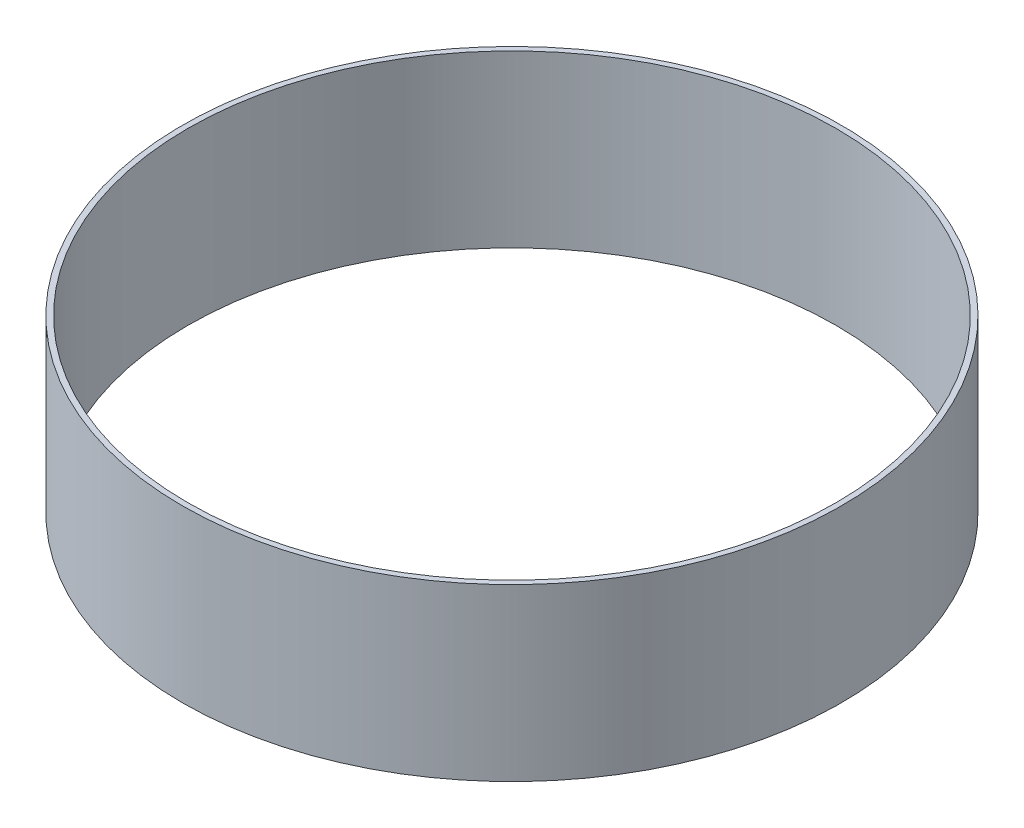
ISO-10303-21;
HEADER;
FILE_DESCRIPTION(('STEP AP214'),'2;1');
FILE_NAME('part.step','',(''),(''),'','','');
FILE_SCHEMA(('AUTOMOTIVE_DESIGN { 1 0 10303 214 1 1 1 1 }'));
ENDSEC;
DATA;
#1=APPLICATION_CONTEXT('core data for automotive mechanical design processes');
#2=APPLICATION_PROTOCOL_DEFINITION('international standard','automotive_design',2000,#1);
#3=PRODUCT_CONTEXT('',#1,'mechanical');
#4=PRODUCT('Part','Part','',(#3));
#5=PRODUCT_RELATED_PRODUCT_CATEGORY('part','',(#4));
#6=PRODUCT_DEFINITION_FORMATION('','',#4);
#7=PRODUCT_DEFINITION_CONTEXT('part definition',#1,'design');
#8=PRODUCT_DEFINITION('design','',#6,#7);
#9=PRODUCT_DEFINITION_SHAPE('','',#8);
#10=(LENGTH_UNIT() NAMED_UNIT(*) SI_UNIT(.MILLI.,.METRE.));
#11=(NAMED_UNIT(*) PLANE_ANGLE_UNIT() SI_UNIT($,.RADIAN.));
#12=(NAMED_UNIT(*) SI_UNIT($,.STERADIAN.) SOLID_ANGLE_UNIT());
#13=UNCERTAINTY_MEASURE_WITH_UNIT(LENGTH_MEASURE(1.E-05),#10,'distance_accuracy_value','');
#14=(GEOMETRIC_REPRESENTATION_CONTEXT(3) GLOBAL_UNCERTAINTY_ASSIGNED_CONTEXT((#13)) GLOBAL_UNIT_ASSIGNED_CONTEXT((#10,
#11,#12)) REPRESENTATION_CONTEXT('',''));
#15=CARTESIAN_POINT('',(0.,0.,0.));
#16=DIRECTION('',(0.,0.,1.));
#17=DIRECTION('',(1.,0.,0.));
#18=AXIS2_PLACEMENT_3D('',#15,#16,#17);
#19=CARTESIAN_POINT('',(0.,11.,0.));
#20=DIRECTION('',(0.,1.,0.));
#21=DIRECTION('',(0.,0.,1.));
#22=AXIS2_PLACEMENT_3D('',#19,#20,#21);
#23=PLANE('',#22);
#24=CARTESIAN_POINT('',(0.,11.,0.));
#25=DIRECTION('',(0.,1.,0.));
#26=DIRECTION('',(0.,0.,1.));
#27=AXIS2_PLACEMENT_3D('',#24,#25,#26);
#28=CIRCLE('',#27,21.25);
#29=CARTESIAN_POINT('',(0.,11.,21.25));
#30=VERTEX_POINT('',#29);
#31=EDGE_CURVE('E10',#30,#30,#28,.T.);
#32=ORIENTED_EDGE('',*,*,#31,.T.);
#33=EDGE_LOOP('',(#32));
#34=FACE_BOUND('',#33,.T.);
#35=CARTESIAN_POINT('',(0.,11.,0.));
#36=DIRECTION('',(0.,1.,0.));
#37=DIRECTION('',(0.,0.,1.));
#38=AXIS2_PLACEMENT_3D('',#35,#36,#37);
#39=CIRCLE('',#38,20.9);
#40=CARTESIAN_POINT('',(0.,11.,20.9));
#41=VERTEX_POINT('',#40);
#42=EDGE_CURVE('E42',#41,#41,#39,.T.);
#43=ORIENTED_EDGE('',*,*,#42,.F.);
#44=EDGE_LOOP('',(#43));
#45=FACE_BOUND('',#44,.T.);
#46=ADVANCED_FACE('F31',(#34,#45),#23,.T.);
#47=CARTESIAN_POINT('',(0.,0.,0.));
#48=DIRECTION('',(0.,1.,0.));
#49=DIRECTION('',(0.,0.,1.));
#50=AXIS2_PLACEMENT_3D('',#47,#48,#49);
#51=PLANE('',#50);
#52=CARTESIAN_POINT('',(0.,0.,0.));
#53=DIRECTION('',(0.,1.,0.));
#54=DIRECTION('',(0.,0.,1.));
#55=AXIS2_PLACEMENT_3D('',#52,#53,#54);
#56=CIRCLE('',#55,21.25);
#57=CARTESIAN_POINT('',(0.,0.,21.25));
#58=VERTEX_POINT('',#57);
#59=EDGE_CURVE('E35',#58,#58,#56,.T.);
#60=ORIENTED_EDGE('',*,*,#59,.F.);
#61=EDGE_LOOP('',(#60));
#62=FACE_BOUND('',#61,.T.);
#63=CARTESIAN_POINT('',(0.,0.,0.));
#64=DIRECTION('',(0.,1.,0.));
#65=DIRECTION('',(0.,0.,1.));
#66=AXIS2_PLACEMENT_3D('',#63,#64,#65);
#67=CIRCLE('',#66,20.9);
#68=CARTESIAN_POINT('',(0.,0.,20.9));
#69=VERTEX_POINT('',#68);
#70=EDGE_CURVE('E44',#69,#69,#67,.T.);
#71=ORIENTED_EDGE('',*,*,#70,.T.);
#72=EDGE_LOOP('',(#71));
#73=FACE_BOUND('',#72,.T.);
#74=ADVANCED_FACE('F54',(#62,#73),#51,.F.);
#75=CARTESIAN_POINT('',(0.,11.,0.));
#76=DIRECTION('',(0.,-1.,0.));
#77=DIRECTION('',(0.,0.,-1.));
#78=AXIS2_PLACEMENT_3D('',#75,#76,#77);
#79=CYLINDRICAL_SURFACE('',#78,21.25);
#80=ORIENTED_EDGE('',*,*,#31,.F.);
#81=EDGE_LOOP('',(#80));
#82=FACE_BOUND('',#81,.T.);
#83=ORIENTED_EDGE('',*,*,#59,.T.);
#84=EDGE_LOOP('',(#83));
#85=FACE_BOUND('',#84,.T.);
#86=ADVANCED_FACE('F33',(#82,#85),#79,.T.);
#87=CARTESIAN_POINT('',(0.,11.,0.));
#88=DIRECTION('',(0.,-1.,0.));
#89=DIRECTION('',(0.,0.,-1.));
#90=AXIS2_PLACEMENT_3D('',#87,#88,#89);
#91=CYLINDRICAL_SURFACE('',#90,20.9);
#92=ORIENTED_EDGE('',*,*,#42,.T.);
#93=EDGE_LOOP('',(#92));
#94=FACE_BOUND('',#93,.T.);
#95=ORIENTED_EDGE('',*,*,#70,.F.);
#96=EDGE_LOOP('',(#95));
#97=FACE_BOUND('',#96,.T.);
#98=ADVANCED_FACE('F50',(#94,#97),#91,.F.);
#99=CLOSED_SHELL('',(#46,#74,#86,#98));
#100=MANIFOLD_SOLID_BREP('B2',#99);
#101=ADVANCED_BREP_SHAPE_REPRESENTATION('',(#18,#100),#14);
#102=SHAPE_DEFINITION_REPRESENTATION(#9,#101);
ENDSEC;
END-ISO-10303-21;
